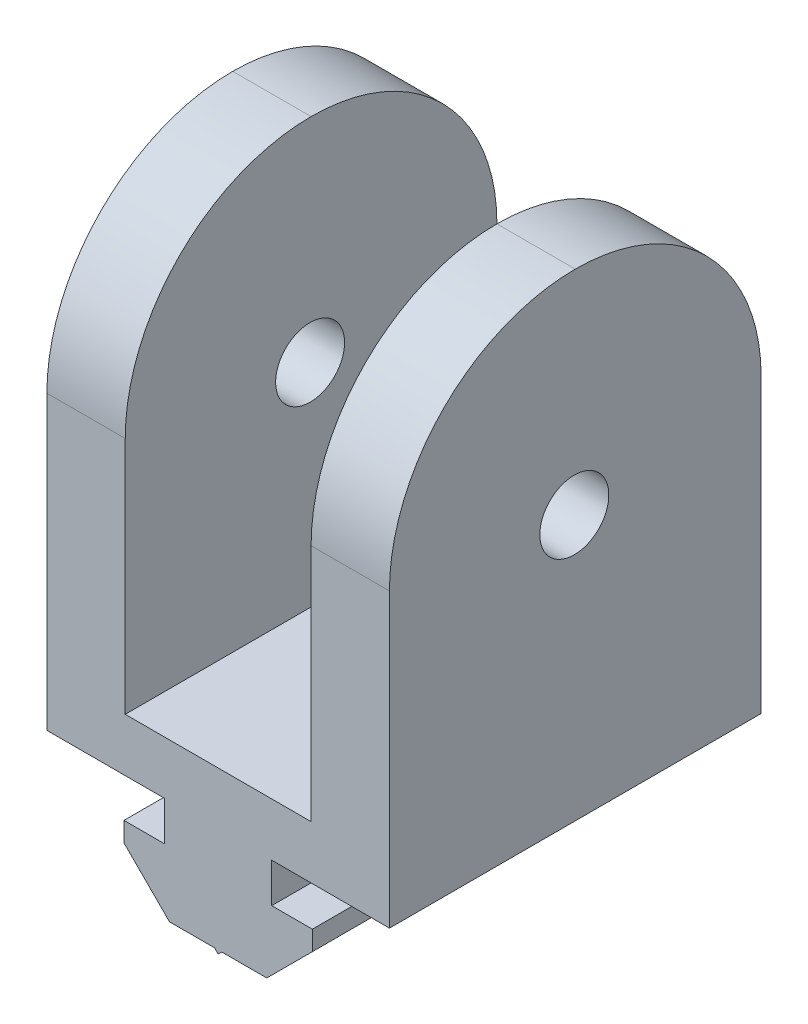
ISO-10303-21;
HEADER;
FILE_DESCRIPTION(('STEP AP214'),'2;1');
FILE_NAME('part.step','',(''),(''),'','','');
FILE_SCHEMA(('AUTOMOTIVE_DESIGN { 1 0 10303 214 1 1 1 1 }'));
ENDSEC;
DATA;
#1=APPLICATION_CONTEXT('core data for automotive mechanical design processes');
#2=APPLICATION_PROTOCOL_DEFINITION('international standard','automotive_design',2000,#1);
#3=PRODUCT_CONTEXT('',#1,'mechanical');
#4=PRODUCT('Part','Part','',(#3));
#5=PRODUCT_RELATED_PRODUCT_CATEGORY('part','',(#4));
#6=PRODUCT_DEFINITION_FORMATION('','',#4);
#7=PRODUCT_DEFINITION_CONTEXT('part definition',#1,'design');
#8=PRODUCT_DEFINITION('design','',#6,#7);
#9=PRODUCT_DEFINITION_SHAPE('','',#8);
#10=(LENGTH_UNIT() NAMED_UNIT(*) SI_UNIT(.MILLI.,.METRE.));
#11=(NAMED_UNIT(*) PLANE_ANGLE_UNIT() SI_UNIT($,.RADIAN.));
#12=(NAMED_UNIT(*) SI_UNIT($,.STERADIAN.) SOLID_ANGLE_UNIT());
#13=UNCERTAINTY_MEASURE_WITH_UNIT(LENGTH_MEASURE(1.E-05),#10,'distance_accuracy_value','');
#14=(GEOMETRIC_REPRESENTATION_CONTEXT(3) GLOBAL_UNCERTAINTY_ASSIGNED_CONTEXT((#13)) GLOBAL_UNIT_ASSIGNED_CONTEXT((#10,
#11,#12)) REPRESENTATION_CONTEXT('',''));
#15=CARTESIAN_POINT('',(0.,0.,0.));
#16=DIRECTION('',(0.,0.,1.));
#17=DIRECTION('',(1.,0.,0.));
#18=AXIS2_PLACEMENT_3D('',#15,#16,#17);
#19=CARTESIAN_POINT('',(0.,0.,0.));
#20=DIRECTION('',(0.,1.,0.));
#21=DIRECTION('',(0.,0.,1.));
#22=AXIS2_PLACEMENT_3D('',#19,#20,#21);
#23=PLANE('',#22);
#24=DIRECTION('',(0.,0.,-1.));
#25=VECTOR('',#24,1.);
#26=CARTESIAN_POINT('',(-11.6351031276717,0.,46.3308796469463));
#27=LINE('',#26,#25);
#28=CARTESIAN_POINT('',(-11.6351031276717,0.,12.4088068181818));
#29=VERTEX_POINT('',#28);
#30=CARTESIAN_POINT('',(-11.6351031276717,0.,-9.29119318181818));
#31=VERTEX_POINT('',#30);
#32=EDGE_CURVE('E257',#29,#31,#27,.T.);
#33=ORIENTED_EDGE('',*,*,#32,.T.);
#34=DIRECTION('',(-1.,0.,0.));
#35=VECTOR('',#34,1.);
#36=CARTESIAN_POINT('',(-18.8401031276717,0.,-9.29119318181818));
#37=LINE('',#36,#35);
#38=CARTESIAN_POINT('',(-4.7601031276717,0.,-9.29119318181818));
#39=VERTEX_POINT('',#38);
#40=EDGE_CURVE('E218',#39,#31,#37,.T.);
#41=ORIENTED_EDGE('',*,*,#40,.F.);
#42=DIRECTION('',(0.,0.,-1.));
#43=VECTOR('',#42,1.);
#44=CARTESIAN_POINT('',(-4.7601031276717,0.,25.0901356129099));
#45=LINE('',#44,#43);
#46=CARTESIAN_POINT('',(-4.7601031276717,0.,12.4088068181818));
#47=VERTEX_POINT('',#46);
#48=EDGE_CURVE('E343',#47,#39,#45,.T.);
#49=ORIENTED_EDGE('',*,*,#48,.F.);
#50=DIRECTION('',(1.,0.,0.));
#51=VECTOR('',#50,1.);
#52=CARTESIAN_POINT('',(-18.8401031276717,0.,12.4088068181818));
#53=LINE('',#52,#51);
#54=EDGE_CURVE('E224',#29,#47,#53,.T.);
#55=ORIENTED_EDGE('',*,*,#54,.F.);
#56=EDGE_LOOP('',(#33,#41,#49,#55));
#57=FACE_BOUND('',#56,.T.);
#58=ADVANCED_FACE('F35',(#57),#23,.F.);
#59=CARTESIAN_POINT('',(-18.8401031276717,3.1,12.4088068181818));
#60=DIRECTION('',(0.,0.,-1.));
#61=DIRECTION('',(-1.,0.,0.));
#62=AXIS2_PLACEMENT_3D('',#59,#60,#61);
#63=PLANE('',#62);
#64=CARTESIAN_POINT('',(1.4898968723283,0.,12.4088068181818));
#65=VERTEX_POINT('',#64);
#66=CARTESIAN_POINT('',(8.36489687232829,0.,12.4088068181818));
#67=VERTEX_POINT('',#66);
#68=EDGE_CURVE('E374',#65,#67,#53,.T.);
#69=ORIENTED_EDGE('',*,*,#68,.T.);
#70=DIRECTION('',(0.,-1.,0.));
#71=VECTOR('',#70,1.);
#72=CARTESIAN_POINT('',(8.3648968723283,0.,12.4088068181818));
#73=LINE('',#72,#71);
#74=CARTESIAN_POINT('',(8.3648968723283,17.05,12.4088068181818));
#75=VERTEX_POINT('',#74);
#76=EDGE_CURVE('E196',#75,#67,#73,.T.);
#77=ORIENTED_EDGE('',*,*,#76,.F.);
#78=DIRECTION('',(1.,0.,0.));
#79=VECTOR('',#78,1.);
#80=CARTESIAN_POINT('',(3.7898968723283,17.05,12.4088068181818));
#81=LINE('',#80,#79);
#82=CARTESIAN_POINT('',(3.7898968723283,17.05,12.4088068181818));
#83=VERTEX_POINT('',#82);
#84=EDGE_CURVE('E231',#75,#83,#81,.F.);
#85=ORIENTED_EDGE('',*,*,#84,.T.);
#86=DIRECTION('',(0.,-1.,0.));
#87=VECTOR('',#86,1.);
#88=CARTESIAN_POINT('',(3.7898968723283,27.9,12.4088068181818));
#89=LINE('',#88,#87);
#90=CARTESIAN_POINT('',(3.7898968723283,3.1,12.4088068181818));
#91=VERTEX_POINT('',#90);
#92=EDGE_CURVE('E365',#83,#91,#89,.T.);
#93=ORIENTED_EDGE('',*,*,#92,.T.);
#94=DIRECTION('',(1.,0.,0.));
#95=VECTOR('',#94,1.);
#96=CARTESIAN_POINT('',(-18.8401031276717,3.1,12.4088068181818));
#97=LINE('',#96,#95);
#98=CARTESIAN_POINT('',(-7.0601031276717,3.1,12.4088068181818));
#99=VERTEX_POINT('',#98);
#100=EDGE_CURVE('E217',#99,#91,#97,.T.);
#101=ORIENTED_EDGE('',*,*,#100,.F.);
#102=DIRECTION('',(0.,-1.,0.));
#103=VECTOR('',#102,1.);
#104=CARTESIAN_POINT('',(-7.0601031276717,27.9,12.4088068181818));
#105=LINE('',#104,#103);
#106=CARTESIAN_POINT('',(-7.0601031276717,17.05,12.4088068181818));
#107=VERTEX_POINT('',#106);
#108=EDGE_CURVE('E373',#107,#99,#105,.T.);
#109=ORIENTED_EDGE('',*,*,#108,.F.);
#110=DIRECTION('',(1.,0.,0.));
#111=VECTOR('',#110,1.);
#112=CARTESIAN_POINT('',(-12.6401031276717,17.05,12.4088068181818));
#113=LINE('',#112,#111);
#114=CARTESIAN_POINT('',(-11.6351031276717,17.05,12.4088068181818));
#115=VERTEX_POINT('',#114);
#116=EDGE_CURVE('E228',#107,#115,#113,.F.);
#117=ORIENTED_EDGE('',*,*,#116,.T.);
#118=DIRECTION('',(0.,-1.,0.));
#119=VECTOR('',#118,1.);
#120=CARTESIAN_POINT('',(-11.6351031276717,0.,12.4088068181818));
#121=LINE('',#120,#119);
#122=EDGE_CURVE('E211',#115,#29,#121,.T.);
#123=ORIENTED_EDGE('',*,*,#122,.T.);
#124=ORIENTED_EDGE('',*,*,#54,.T.);
#125=DIRECTION('',(0.,1.,0.));
#126=VECTOR('',#125,1.);
#127=CARTESIAN_POINT('',(-4.7601031276717,0.,12.4088068181818));
#128=LINE('',#127,#126);
#129=CARTESIAN_POINT('',(-4.7601031276717,-2.3,12.4088068181818));
#130=VERTEX_POINT('',#129);
#131=EDGE_CURVE('E278',#130,#47,#128,.T.);
#132=ORIENTED_EDGE('',*,*,#131,.F.);
#133=DIRECTION('',(1.,0.,0.));
#134=VECTOR('',#133,1.);
#135=CARTESIAN_POINT('',(0.,-2.3,12.4088068181818));
#136=LINE('',#135,#134);
#137=CARTESIAN_POINT('',(-7.1351031276717,-2.3,12.4088068181818));
#138=VERTEX_POINT('',#137);
#139=EDGE_CURVE('E275',#138,#130,#136,.T.);
#140=ORIENTED_EDGE('',*,*,#139,.F.);
#141=DIRECTION('',(0.,-1.,0.));
#142=VECTOR('',#141,1.);
#143=CARTESIAN_POINT('',(-7.1351031276717,0.,12.4088068181818));
#144=LINE('',#143,#142);
#145=CARTESIAN_POINT('',(-7.1351031276717,-3.43933982822025,12.4088068181818));
#146=VERTEX_POINT('',#145);
#147=EDGE_CURVE('E273',#138,#146,#144,.T.);
#148=ORIENTED_EDGE('',*,*,#147,.T.);
#149=DIRECTION('',(0.707106781186551,-0.707106781186544,0.));
#150=VECTOR('',#149,1.);
#151=CARTESIAN_POINT('',(-5.28722147794593,-5.28722147794599,12.4088068181818));
#152=LINE('',#151,#150);
#153=CARTESIAN_POINT('',(-4.47444295589192,-6.1,12.4088068181818));
#154=VERTEX_POINT('',#153);
#155=EDGE_CURVE('E270',#146,#154,#152,.T.);
#156=ORIENTED_EDGE('',*,*,#155,.T.);
#157=DIRECTION('',(1.,0.,0.));
#158=VECTOR('',#157,1.);
#159=CARTESIAN_POINT('',(0.,-6.1,12.4088068181818));
#160=LINE('',#159,#158);
#161=CARTESIAN_POINT('',(-1.8451031276717,-6.1,12.4088068181818));
#162=VERTEX_POINT('',#161);
#163=EDGE_CURVE('E268',#154,#162,#160,.T.);
#164=ORIENTED_EDGE('',*,*,#163,.T.);
#165=DIRECTION('',(0.707106781186551,-0.707106781186544,0.));
#166=VECTOR('',#165,1.);
#167=CARTESIAN_POINT('',(-3.97255156383584,-3.97255156383588,12.4088068181818));
#168=LINE('',#167,#166);
#169=CARTESIAN_POINT('',(-1.6351031276717,-6.31,12.4088068181818));
#170=VERTEX_POINT('',#169);
#171=EDGE_CURVE('E297',#162,#170,#168,.T.);
#172=ORIENTED_EDGE('',*,*,#171,.T.);
#173=DIRECTION('',(-0.707106781186551,-0.707106781186544,0.));
#174=VECTOR('',#173,1.);
#175=CARTESIAN_POINT('',(2.33744843616416,-2.33744843616419,12.4088068181818));
#176=LINE('',#175,#174);
#177=CARTESIAN_POINT('',(-1.4251031276717,-6.1,12.4088068181818));
#178=VERTEX_POINT('',#177);
#179=EDGE_CURVE('E294',#178,#170,#176,.T.);
#180=ORIENTED_EDGE('',*,*,#179,.F.);
#181=DIRECTION('',(-1.,0.,0.));
#182=VECTOR('',#181,1.);
#183=CARTESIAN_POINT('',(0.,-6.1,12.4088068181818));
#184=LINE('',#183,#182);
#185=CARTESIAN_POINT('',(1.20423670054852,-6.1,12.4088068181818));
#186=VERTEX_POINT('',#185);
#187=EDGE_CURVE('E291',#186,#178,#184,.T.);
#188=ORIENTED_EDGE('',*,*,#187,.F.);
#189=DIRECTION('',(-0.707106781186551,-0.707106781186544,0.));
#190=VECTOR('',#189,1.);
#191=CARTESIAN_POINT('',(3.65211835027425,-3.65211835027429,12.4088068181818));
#192=LINE('',#191,#190);
#193=CARTESIAN_POINT('',(3.8648968723283,-3.43933982822025,12.4088068181818));
#194=VERTEX_POINT('',#193);
#195=EDGE_CURVE('E288',#194,#186,#192,.T.);
#196=ORIENTED_EDGE('',*,*,#195,.F.);
#197=DIRECTION('',(0.,-1.,0.));
#198=VECTOR('',#197,1.);
#199=CARTESIAN_POINT('',(3.8648968723283,0.,12.4088068181818));
#200=LINE('',#199,#198);
#201=CARTESIAN_POINT('',(3.8648968723283,-2.3,12.4088068181818));
#202=VERTEX_POINT('',#201);
#203=EDGE_CURVE('E285',#202,#194,#200,.T.);
#204=ORIENTED_EDGE('',*,*,#203,.F.);
#205=DIRECTION('',(-1.,0.,0.));
#206=VECTOR('',#205,1.);
#207=CARTESIAN_POINT('',(0.,-2.3,12.4088068181818));
#208=LINE('',#207,#206);
#209=CARTESIAN_POINT('',(1.4898968723283,-2.3,12.4088068181818));
#210=VERTEX_POINT('',#209);
#211=EDGE_CURVE('E283',#202,#210,#208,.T.);
#212=ORIENTED_EDGE('',*,*,#211,.T.);
#213=DIRECTION('',(0.,1.,0.));
#214=VECTOR('',#213,1.);
#215=CARTESIAN_POINT('',(1.4898968723283,0.,12.4088068181818));
#216=LINE('',#215,#214);
#217=EDGE_CURVE('E281',#210,#65,#216,.T.);
#218=ORIENTED_EDGE('',*,*,#217,.T.);
#219=EDGE_LOOP('',(#69,#77,#85,#93,#101,#109,#117,#123,#124,#132,#140,#148,#156,#164,#172,#180,
#188,#196,#204,#212,#218));
#220=FACE_BOUND('',#219,.T.);
#221=ADVANCED_FACE('F392',(#220),#63,.F.);
#222=CARTESIAN_POINT('',(-18.8401031276717,3.1,-9.29119318181818));
#223=DIRECTION('',(0.,0.,1.));
#224=DIRECTION('',(1.,0.,0.));
#225=AXIS2_PLACEMENT_3D('',#222,#223,#224);
#226=PLANE('',#225);
#227=DIRECTION('',(-1.,0.,0.));
#228=VECTOR('',#227,1.);
#229=CARTESIAN_POINT('',(9.3698968723283,17.05,-9.29119318181818));
#230=LINE('',#229,#228);
#231=CARTESIAN_POINT('',(3.7898968723283,17.05,-9.29119318181818));
#232=VERTEX_POINT('',#231);
#233=CARTESIAN_POINT('',(8.3648968723283,17.05,-9.29119318181818));
#234=VERTEX_POINT('',#233);
#235=EDGE_CURVE('E210',#232,#234,#230,.F.);
#236=ORIENTED_EDGE('',*,*,#235,.T.);
#237=DIRECTION('',(0.,1.,0.));
#238=VECTOR('',#237,1.);
#239=CARTESIAN_POINT('',(8.3648968723283,0.,-9.29119318181818));
#240=LINE('',#239,#238);
#241=CARTESIAN_POINT('',(8.36489687232829,0.,-9.29119318181818));
#242=VERTEX_POINT('',#241);
#243=EDGE_CURVE('E194',#242,#234,#240,.T.);
#244=ORIENTED_EDGE('',*,*,#243,.F.);
#245=CARTESIAN_POINT('',(1.4898968723283,0.,-9.29119318181818));
#246=VERTEX_POINT('',#245);
#247=EDGE_CURVE('E206',#242,#246,#37,.T.);
#248=ORIENTED_EDGE('',*,*,#247,.T.);
#249=DIRECTION('',(0.,-1.,0.));
#250=VECTOR('',#249,1.);
#251=CARTESIAN_POINT('',(1.4898968723283,0.,-9.29119318181818));
#252=LINE('',#251,#250);
#253=CARTESIAN_POINT('',(1.4898968723283,-2.3,-9.29119318181818));
#254=VERTEX_POINT('',#253);
#255=EDGE_CURVE('E318',#246,#254,#252,.T.);
#256=ORIENTED_EDGE('',*,*,#255,.T.);
#257=DIRECTION('',(1.,0.,0.));
#258=VECTOR('',#257,1.);
#259=CARTESIAN_POINT('',(0.,-2.3,-9.29119318181818));
#260=LINE('',#259,#258);
#261=CARTESIAN_POINT('',(3.8648968723283,-2.3,-9.29119318181818));
#262=VERTEX_POINT('',#261);
#263=EDGE_CURVE('E320',#254,#262,#260,.T.);
#264=ORIENTED_EDGE('',*,*,#263,.T.);
#265=DIRECTION('',(0.,1.,0.));
#266=VECTOR('',#265,1.);
#267=CARTESIAN_POINT('',(3.8648968723283,0.,-9.29119318181818));
#268=LINE('',#267,#266);
#269=CARTESIAN_POINT('',(3.8648968723283,-3.43933982822025,-9.29119318181818));
#270=VERTEX_POINT('',#269);
#271=EDGE_CURVE('E323',#270,#262,#268,.T.);
#272=ORIENTED_EDGE('',*,*,#271,.F.);
#273=DIRECTION('',(0.707106781186551,0.707106781186544,0.));
#274=VECTOR('',#273,1.);
#275=CARTESIAN_POINT('',(3.65211835027425,-3.65211835027429,-9.29119318181818));
#276=LINE('',#275,#274);
#277=CARTESIAN_POINT('',(1.20423670054852,-6.1,-9.29119318181818));
#278=VERTEX_POINT('',#277);
#279=EDGE_CURVE('E326',#278,#270,#276,.T.);
#280=ORIENTED_EDGE('',*,*,#279,.F.);
#281=DIRECTION('',(1.,0.,0.));
#282=VECTOR('',#281,1.);
#283=CARTESIAN_POINT('',(0.,-6.1,-9.29119318181818));
#284=LINE('',#283,#282);
#285=CARTESIAN_POINT('',(-1.4251031276717,-6.1,-9.29119318181818));
#286=VERTEX_POINT('',#285);
#287=EDGE_CURVE('E329',#286,#278,#284,.T.);
#288=ORIENTED_EDGE('',*,*,#287,.F.);
#289=DIRECTION('',(0.707106781186551,0.707106781186544,0.));
#290=VECTOR('',#289,1.);
#291=CARTESIAN_POINT('',(2.33744843616416,-2.33744843616419,-9.29119318181818));
#292=LINE('',#291,#290);
#293=CARTESIAN_POINT('',(-1.6351031276717,-6.31,-9.29119318181818));
#294=VERTEX_POINT('',#293);
#295=EDGE_CURVE('E267',#294,#286,#292,.T.);
#296=ORIENTED_EDGE('',*,*,#295,.F.);
#297=DIRECTION('',(-0.707106781186551,0.707106781186544,0.));
#298=VECTOR('',#297,1.);
#299=CARTESIAN_POINT('',(-3.97255156383584,-3.97255156383588,-9.29119318181818));
#300=LINE('',#299,#298);
#301=CARTESIAN_POINT('',(-1.8451031276717,-6.1,-9.29119318181818));
#302=VERTEX_POINT('',#301);
#303=EDGE_CURVE('E300',#294,#302,#300,.T.);
#304=ORIENTED_EDGE('',*,*,#303,.T.);
#305=DIRECTION('',(-1.,0.,0.));
#306=VECTOR('',#305,1.);
#307=CARTESIAN_POINT('',(0.,-6.1,-9.29119318181818));
#308=LINE('',#307,#306);
#309=CARTESIAN_POINT('',(-4.47444295589192,-6.1,-9.29119318181818));
#310=VERTEX_POINT('',#309);
#311=EDGE_CURVE('E303',#302,#310,#308,.T.);
#312=ORIENTED_EDGE('',*,*,#311,.T.);
#313=DIRECTION('',(-0.707106781186551,0.707106781186544,0.));
#314=VECTOR('',#313,1.);
#315=CARTESIAN_POINT('',(-5.28722147794593,-5.28722147794599,-9.29119318181818));
#316=LINE('',#315,#314);
#317=CARTESIAN_POINT('',(-7.1351031276717,-3.43933982822025,-9.29119318181818));
#318=VERTEX_POINT('',#317);
#319=EDGE_CURVE('E306',#310,#318,#316,.T.);
#320=ORIENTED_EDGE('',*,*,#319,.T.);
#321=DIRECTION('',(0.,1.,0.));
#322=VECTOR('',#321,1.);
#323=CARTESIAN_POINT('',(-7.1351031276717,0.,-9.29119318181818));
#324=LINE('',#323,#322);
#325=CARTESIAN_POINT('',(-7.1351031276717,-2.3,-9.29119318181818));
#326=VERTEX_POINT('',#325);
#327=EDGE_CURVE('E309',#318,#326,#324,.T.);
#328=ORIENTED_EDGE('',*,*,#327,.T.);
#329=DIRECTION('',(-1.,0.,0.));
#330=VECTOR('',#329,1.);
#331=CARTESIAN_POINT('',(0.,-2.3,-9.29119318181818));
#332=LINE('',#331,#330);
#333=CARTESIAN_POINT('',(-4.7601031276717,-2.3,-9.29119318181818));
#334=VERTEX_POINT('',#333);
#335=EDGE_CURVE('E312',#334,#326,#332,.T.);
#336=ORIENTED_EDGE('',*,*,#335,.F.);
#337=DIRECTION('',(0.,-1.,0.));
#338=VECTOR('',#337,1.);
#339=CARTESIAN_POINT('',(-4.7601031276717,0.,-9.29119318181818));
#340=LINE('',#339,#338);
#341=EDGE_CURVE('E315',#39,#334,#340,.T.);
#342=ORIENTED_EDGE('',*,*,#341,.F.);
#343=ORIENTED_EDGE('',*,*,#40,.T.);
#344=DIRECTION('',(0.,1.,0.));
#345=VECTOR('',#344,1.);
#346=CARTESIAN_POINT('',(-11.6351031276717,0.,-9.29119318181818));
#347=LINE('',#346,#345);
#348=CARTESIAN_POINT('',(-11.6351031276717,17.05,-9.29119318181818));
#349=VERTEX_POINT('',#348);
#350=EDGE_CURVE('E258',#31,#349,#347,.T.);
#351=ORIENTED_EDGE('',*,*,#350,.T.);
#352=DIRECTION('',(-1.,0.,0.));
#353=VECTOR('',#352,1.);
#354=CARTESIAN_POINT('',(-7.0601031276717,17.05,-9.29119318181818));
#355=LINE('',#354,#353);
#356=CARTESIAN_POINT('',(-7.0601031276717,17.05,-9.29119318181818));
#357=VERTEX_POINT('',#356);
#358=EDGE_CURVE('E238',#349,#357,#355,.F.);
#359=ORIENTED_EDGE('',*,*,#358,.T.);
#360=DIRECTION('',(0.,-1.,0.));
#361=VECTOR('',#360,1.);
#362=CARTESIAN_POINT('',(-7.0601031276717,27.9,-9.29119318181818));
#363=LINE('',#362,#361);
#364=CARTESIAN_POINT('',(-7.0601031276717,3.1,-9.29119318181818));
#365=VERTEX_POINT('',#364);
#366=EDGE_CURVE('E370',#357,#365,#363,.T.);
#367=ORIENTED_EDGE('',*,*,#366,.T.);
#368=DIRECTION('',(-1.,0.,0.));
#369=VECTOR('',#368,1.);
#370=CARTESIAN_POINT('',(-18.8401031276717,3.1,-9.29119318181818));
#371=LINE('',#370,#369);
#372=CARTESIAN_POINT('',(3.7898968723283,3.1,-9.29119318181818));
#373=VERTEX_POINT('',#372);
#374=EDGE_CURVE('E221',#373,#365,#371,.T.);
#375=ORIENTED_EDGE('',*,*,#374,.F.);
#376=DIRECTION('',(0.,-1.,0.));
#377=VECTOR('',#376,1.);
#378=CARTESIAN_POINT('',(3.7898968723283,27.9,-9.29119318181818));
#379=LINE('',#378,#377);
#380=EDGE_CURVE('E363',#232,#373,#379,.T.);
#381=ORIENTED_EDGE('',*,*,#380,.F.);
#382=EDGE_LOOP('',(#236,#244,#248,#256,#264,#272,#280,#288,#296,#304,#312,#320,#328,#336,#342,
#343,#351,#359,#367,#375,#381));
#383=FACE_BOUND('',#382,.T.);
#384=ADVANCED_FACE('F204',(#383),#226,.F.);
#385=CARTESIAN_POINT('',(0.,17.05,1.55880681818182));
#386=DIRECTION('',(-1.,0.,0.));
#387=DIRECTION('',(0.,0.,1.));
#388=AXIS2_PLACEMENT_3D('',#385,#386,#387);
#389=CYLINDRICAL_SURFACE('',#388,10.85);
#390=DIRECTION('',(1.,0.,0.));
#391=VECTOR('',#390,1.);
#392=CARTESIAN_POINT('',(-7.0601031276717,27.9,1.55880681818182));
#393=LINE('',#392,#391);
#394=CARTESIAN_POINT('',(-11.6351031276717,27.9,1.55880681818182));
#395=VERTEX_POINT('',#394);
#396=CARTESIAN_POINT('',(-7.0601031276717,27.9,1.55880681818182));
#397=VERTEX_POINT('',#396);
#398=EDGE_CURVE('E245',#395,#397,#393,.T.);
#399=ORIENTED_EDGE('',*,*,#398,.F.);
#400=CARTESIAN_POINT('',(-11.6351031276717,17.05,1.55880681818182));
#401=DIRECTION('',(-1.,0.,0.));
#402=DIRECTION('',(0.,0.,1.));
#403=AXIS2_PLACEMENT_3D('',#400,#401,#402);
#404=CIRCLE('',#403,10.85);
#405=EDGE_CURVE('E60',#395,#115,#404,.F.);
#406=ORIENTED_EDGE('',*,*,#405,.T.);
#407=ORIENTED_EDGE('',*,*,#116,.F.);
#408=CARTESIAN_POINT('',(-7.0601031276717,17.05,1.55880681818182));
#409=DIRECTION('',(-1.,0.,0.));
#410=DIRECTION('',(0.,0.,1.));
#411=AXIS2_PLACEMENT_3D('',#408,#409,#410);
#412=CIRCLE('',#411,10.85);
#413=EDGE_CURVE('E44',#397,#107,#412,.F.);
#414=ORIENTED_EDGE('',*,*,#413,.F.);
#415=EDGE_LOOP('',(#399,#406,#407,#414));
#416=FACE_BOUND('',#415,.T.);
#417=ADVANCED_FACE('F37',(#416),#389,.T.);
#418=CARTESIAN_POINT('',(0.,17.05,1.55880681818182));
#419=DIRECTION('',(1.,0.,0.));
#420=DIRECTION('',(0.,0.,-1.));
#421=AXIS2_PLACEMENT_3D('',#418,#419,#420);
#422=CYLINDRICAL_SURFACE('',#421,10.85);
#423=ORIENTED_EDGE('',*,*,#358,.F.);
#424=CARTESIAN_POINT('',(-11.6351031276717,17.05,1.55880681818182));
#425=DIRECTION('',(-1.,0.,0.));
#426=DIRECTION('',(0.,0.,1.));
#427=AXIS2_PLACEMENT_3D('',#424,#425,#426);
#428=CIRCLE('',#427,10.85);
#429=EDGE_CURVE('E249',#349,#395,#428,.F.);
#430=ORIENTED_EDGE('',*,*,#429,.T.);
#431=ORIENTED_EDGE('',*,*,#398,.T.);
#432=CARTESIAN_POINT('',(-7.0601031276717,17.05,1.55880681818182));
#433=DIRECTION('',(-1.,0.,0.));
#434=DIRECTION('',(0.,0.,1.));
#435=AXIS2_PLACEMENT_3D('',#432,#433,#434);
#436=CIRCLE('',#435,10.85);
#437=EDGE_CURVE('E11',#357,#397,#436,.F.);
#438=ORIENTED_EDGE('',*,*,#437,.F.);
#439=EDGE_LOOP('',(#423,#430,#431,#438));
#440=FACE_BOUND('',#439,.T.);
#441=ADVANCED_FACE('F396',(#440),#422,.T.);
#442=CARTESIAN_POINT('',(27.6598968723283,15.5,1.61572996420886));
#443=DIRECTION('',(-1.,0.,0.));
#444=DIRECTION('',(0.,0.,1.));
#445=AXIS2_PLACEMENT_3D('',#442,#443,#444);
#446=CYLINDRICAL_SURFACE('',#445,2.015);
#447=CARTESIAN_POINT('',(-7.0601031276717,15.5,1.61572996420886));
#448=DIRECTION('',(-1.,0.,0.));
#449=DIRECTION('',(0.,0.,1.));
#450=AXIS2_PLACEMENT_3D('',#447,#448,#449);
#451=CIRCLE('',#450,2.015);
#452=CARTESIAN_POINT('',(-7.0601031276717,15.5,3.63072996420886));
#453=VERTEX_POINT('',#452);
#454=EDGE_CURVE('E246',#453,#453,#451,.T.);
#455=ORIENTED_EDGE('',*,*,#454,.F.);
#456=EDGE_LOOP('',(#455));
#457=FACE_BOUND('',#456,.T.);
#458=CARTESIAN_POINT('',(-11.6351031276717,15.5,1.61572996420886));
#459=DIRECTION('',(-1.,0.,0.));
#460=DIRECTION('',(0.,0.,1.));
#461=AXIS2_PLACEMENT_3D('',#458,#459,#460);
#462=CIRCLE('',#461,2.015);
#463=CARTESIAN_POINT('',(-11.6351031276717,15.5,3.63072996420886));
#464=VERTEX_POINT('',#463);
#465=EDGE_CURVE('E247',#464,#464,#462,.F.);
#466=ORIENTED_EDGE('',*,*,#465,.F.);
#467=EDGE_LOOP('',(#466));
#468=FACE_BOUND('',#467,.T.);
#469=ADVANCED_FACE('F489',(#457,#468),#446,.F.);
#470=CARTESIAN_POINT('',(0.,3.1,0.));
#471=DIRECTION('',(0.,1.,0.));
#472=DIRECTION('',(0.,0.,1.));
#473=AXIS2_PLACEMENT_3D('',#470,#471,#472);
#474=PLANE('',#473);
#475=ORIENTED_EDGE('',*,*,#100,.T.);
#476=DIRECTION('',(0.,0.,1.));
#477=VECTOR('',#476,1.);
#478=CARTESIAN_POINT('',(3.7898968723283,3.1,-9.29119318181818));
#479=LINE('',#478,#477);
#480=EDGE_CURVE('E244',#373,#91,#479,.T.);
#481=ORIENTED_EDGE('',*,*,#480,.F.);
#482=ORIENTED_EDGE('',*,*,#374,.T.);
#483=DIRECTION('',(0.,0.,-1.));
#484=VECTOR('',#483,1.);
#485=CARTESIAN_POINT('',(-7.0601031276717,3.1,-9.29119318181818));
#486=LINE('',#485,#484);
#487=EDGE_CURVE('E368',#99,#365,#486,.T.);
#488=ORIENTED_EDGE('',*,*,#487,.F.);
#489=EDGE_LOOP('',(#475,#481,#482,#488));
#490=FACE_BOUND('',#489,.T.);
#491=ADVANCED_FACE('F380',(#490),#474,.T.);
#492=ORIENTED_EDGE('',*,*,#247,.F.);
#493=DIRECTION('',(0.,0.,-1.));
#494=VECTOR('',#493,1.);
#495=CARTESIAN_POINT('',(8.36489687232829,0.,46.3308796469463));
#496=LINE('',#495,#494);
#497=EDGE_CURVE('E190',#67,#242,#496,.T.);
#498=ORIENTED_EDGE('',*,*,#497,.F.);
#499=ORIENTED_EDGE('',*,*,#68,.F.);
#500=DIRECTION('',(0.,0.,-1.));
#501=VECTOR('',#500,1.);
#502=CARTESIAN_POINT('',(1.4898968723283,0.,25.0901356129099));
#503=LINE('',#502,#501);
#504=EDGE_CURVE('E216',#65,#246,#503,.T.);
#505=ORIENTED_EDGE('',*,*,#504,.T.);
#506=EDGE_LOOP('',(#492,#498,#499,#505));
#507=FACE_BOUND('',#506,.T.);
#508=ADVANCED_FACE('F214',(#507),#23,.F.);
#509=CARTESIAN_POINT('',(-7.0601031276717,27.9,-9.29119318181818));
#510=DIRECTION('',(-1.,0.,0.));
#511=DIRECTION('',(0.,0.,1.));
#512=AXIS2_PLACEMENT_3D('',#509,#510,#511);
#513=PLANE('',#512);
#514=ORIENTED_EDGE('',*,*,#487,.T.);
#515=ORIENTED_EDGE('',*,*,#366,.F.);
#516=ORIENTED_EDGE('',*,*,#437,.T.);
#517=ORIENTED_EDGE('',*,*,#413,.T.);
#518=ORIENTED_EDGE('',*,*,#108,.T.);
#519=EDGE_LOOP('',(#514,#515,#516,#517,#518));
#520=FACE_BOUND('',#519,.T.);
#521=ORIENTED_EDGE('',*,*,#454,.T.);
#522=EDGE_LOOP('',(#521));
#523=FACE_BOUND('',#522,.T.);
#524=ADVANCED_FACE('F386',(#520,#523),#513,.F.);
#525=CARTESIAN_POINT('',(3.7898968723283,27.9,-9.29119318181818));
#526=DIRECTION('',(1.,0.,0.));
#527=DIRECTION('',(0.,0.,-1.));
#528=AXIS2_PLACEMENT_3D('',#525,#526,#527);
#529=PLANE('',#528);
#530=CARTESIAN_POINT('',(3.7898968723283,15.5,1.61572996420886));
#531=DIRECTION('',(1.,0.,0.));
#532=DIRECTION('',(0.,0.,-1.));
#533=AXIS2_PLACEMENT_3D('',#530,#531,#532);
#534=CIRCLE('',#533,2.015);
#535=CARTESIAN_POINT('',(3.7898968723283,15.5,-0.399270035791137));
#536=VERTEX_POINT('',#535);
#537=EDGE_CURVE('E357',#536,#536,#534,.T.);
#538=ORIENTED_EDGE('',*,*,#537,.T.);
#539=EDGE_LOOP('',(#538));
#540=FACE_BOUND('',#539,.T.);
#541=ORIENTED_EDGE('',*,*,#480,.T.);
#542=ORIENTED_EDGE('',*,*,#92,.F.);
#543=CARTESIAN_POINT('',(3.7898968723283,17.05,1.55880681818182));
#544=DIRECTION('',(1.,0.,0.));
#545=DIRECTION('',(0.,0.,-1.));
#546=AXIS2_PLACEMENT_3D('',#543,#544,#545);
#547=CIRCLE('',#546,10.85);
#548=CARTESIAN_POINT('',(3.7898968723283,27.9,1.55880681818182));
#549=VERTEX_POINT('',#548);
#550=EDGE_CURVE('E235',#83,#549,#547,.F.);
#551=ORIENTED_EDGE('',*,*,#550,.T.);
#552=CARTESIAN_POINT('',(3.7898968723283,17.05,1.55880681818182));
#553=DIRECTION('',(1.,0.,0.));
#554=DIRECTION('',(0.,0.,-1.));
#555=AXIS2_PLACEMENT_3D('',#552,#553,#554);
#556=CIRCLE('',#555,10.85);
#557=EDGE_CURVE('E233',#549,#232,#556,.F.);
#558=ORIENTED_EDGE('',*,*,#557,.T.);
#559=ORIENTED_EDGE('',*,*,#380,.T.);
#560=EDGE_LOOP('',(#541,#542,#551,#558,#559));
#561=FACE_BOUND('',#560,.T.);
#562=ADVANCED_FACE('F462',(#540,#561),#529,.F.);
#563=CARTESIAN_POINT('',(0.,17.05,1.55880681818182));
#564=DIRECTION('',(1.,0.,0.));
#565=DIRECTION('',(0.,0.,-1.));
#566=AXIS2_PLACEMENT_3D('',#563,#564,#565);
#567=CYLINDRICAL_SURFACE('',#566,10.85);
#568=CARTESIAN_POINT('',(8.3648968723283,17.05,1.55880681818182));
#569=DIRECTION('',(-1.,0.,0.));
#570=DIRECTION('',(0.,0.,1.));
#571=AXIS2_PLACEMENT_3D('',#568,#569,#570);
#572=CIRCLE('',#571,10.85);
#573=CARTESIAN_POINT('',(8.3648968723283,27.9,1.55880681818182));
#574=VERTEX_POINT('',#573);
#575=EDGE_CURVE('E52',#234,#574,#572,.F.);
#576=ORIENTED_EDGE('',*,*,#575,.F.);
#577=ORIENTED_EDGE('',*,*,#235,.F.);
#578=ORIENTED_EDGE('',*,*,#557,.F.);
#579=DIRECTION('',(-1.,0.,0.));
#580=VECTOR('',#579,1.);
#581=CARTESIAN_POINT('',(3.7898968723283,27.9,1.55880681818182));
#582=LINE('',#581,#580);
#583=EDGE_CURVE('E242',#574,#549,#582,.T.);
#584=ORIENTED_EDGE('',*,*,#583,.F.);
#585=EDGE_LOOP('',(#576,#577,#578,#584));
#586=FACE_BOUND('',#585,.T.);
#587=ADVANCED_FACE('F464',(#586),#567,.T.);
#588=CARTESIAN_POINT('',(0.,17.05,1.55880681818182));
#589=DIRECTION('',(-1.,0.,0.));
#590=DIRECTION('',(0.,0.,1.));
#591=AXIS2_PLACEMENT_3D('',#588,#589,#590);
#592=CYLINDRICAL_SURFACE('',#591,10.85);
#593=CARTESIAN_POINT('',(8.3648968723283,17.05,1.55880681818182));
#594=DIRECTION('',(-1.,0.,0.));
#595=DIRECTION('',(0.,0.,1.));
#596=AXIS2_PLACEMENT_3D('',#593,#594,#595);
#597=CIRCLE('',#596,10.85);
#598=EDGE_CURVE('E264',#574,#75,#597,.F.);
#599=ORIENTED_EDGE('',*,*,#598,.F.);
#600=ORIENTED_EDGE('',*,*,#583,.T.);
#601=ORIENTED_EDGE('',*,*,#550,.F.);
#602=ORIENTED_EDGE('',*,*,#84,.F.);
#603=EDGE_LOOP('',(#599,#600,#601,#602));
#604=FACE_BOUND('',#603,.T.);
#605=ADVANCED_FACE('F457',(#604),#592,.T.);
#606=CARTESIAN_POINT('',(8.3648968723283,15.5,1.61572996420886));
#607=DIRECTION('',(-1.,0.,0.));
#608=DIRECTION('',(0.,0.,1.));
#609=AXIS2_PLACEMENT_3D('',#606,#607,#608);
#610=CIRCLE('',#609,2.015);
#611=CARTESIAN_POINT('',(8.3648968723283,15.5,3.63072996420886));
#612=VERTEX_POINT('',#611);
#613=EDGE_CURVE('E39',#612,#612,#610,.F.);
#614=ORIENTED_EDGE('',*,*,#613,.T.);
#615=EDGE_LOOP('',(#614));
#616=FACE_BOUND('',#615,.T.);
#617=ORIENTED_EDGE('',*,*,#537,.F.);
#618=EDGE_LOOP('',(#617));
#619=FACE_BOUND('',#618,.T.);
#620=ADVANCED_FACE('F471',(#616,#619),#446,.F.);
#621=CARTESIAN_POINT('',(2.33744843616416,-2.33744843616419,25.0901356129099));
#622=DIRECTION('',(-0.707106781186544,0.707106781186551,0.));
#623=DIRECTION('',(-0.707106781186551,-0.707106781186544,0.));
#624=AXIS2_PLACEMENT_3D('',#621,#622,#623);
#625=PLANE('',#624);
#626=DIRECTION('',(0.,0.,-1.));
#627=VECTOR('',#626,1.);
#628=CARTESIAN_POINT('',(-1.4251031276717,-6.1,25.0901356129099));
#629=LINE('',#628,#627);
#630=EDGE_CURVE('E271',#178,#286,#629,.T.);
#631=ORIENTED_EDGE('',*,*,#630,.F.);
#632=ORIENTED_EDGE('',*,*,#179,.T.);
#633=DIRECTION('',(0.,0.,-1.));
#634=VECTOR('',#633,1.);
#635=CARTESIAN_POINT('',(-1.6351031276717,-6.31,25.0901356129099));
#636=LINE('',#635,#634);
#637=EDGE_CURVE('E332',#170,#294,#636,.T.);
#638=ORIENTED_EDGE('',*,*,#637,.T.);
#639=ORIENTED_EDGE('',*,*,#295,.T.);
#640=EDGE_LOOP('',(#631,#632,#638,#639));
#641=FACE_BOUND('',#640,.T.);
#642=ADVANCED_FACE('F432',(#641),#625,.F.);
#643=CARTESIAN_POINT('',(0.,-6.1,25.0901356129099));
#644=DIRECTION('',(0.,1.,0.));
#645=DIRECTION('',(0.,0.,1.));
#646=AXIS2_PLACEMENT_3D('',#643,#644,#645);
#647=PLANE('',#646);
#648=DIRECTION('',(0.,0.,-1.));
#649=VECTOR('',#648,1.);
#650=CARTESIAN_POINT('',(1.20423670054852,-6.1,25.0901356129099));
#651=LINE('',#650,#649);
#652=EDGE_CURVE('E334',#186,#278,#651,.T.);
#653=ORIENTED_EDGE('',*,*,#652,.F.);
#654=ORIENTED_EDGE('',*,*,#187,.T.);
#655=ORIENTED_EDGE('',*,*,#630,.T.);
#656=ORIENTED_EDGE('',*,*,#287,.T.);
#657=EDGE_LOOP('',(#653,#654,#655,#656));
#658=FACE_BOUND('',#657,.T.);
#659=ADVANCED_FACE('F437',(#658),#647,.F.);
#660=CARTESIAN_POINT('',(3.65211835027425,-3.65211835027429,25.0901356129099));
#661=DIRECTION('',(-0.707106781186544,0.707106781186551,0.));
#662=DIRECTION('',(-0.707106781186551,-0.707106781186544,0.));
#663=AXIS2_PLACEMENT_3D('',#660,#661,#662);
#664=PLANE('',#663);
#665=DIRECTION('',(0.,0.,-1.));
#666=VECTOR('',#665,1.);
#667=CARTESIAN_POINT('',(3.8648968723283,-3.43933982822025,25.0901356129099));
#668=LINE('',#667,#666);
#669=EDGE_CURVE('E336',#194,#270,#668,.T.);
#670=ORIENTED_EDGE('',*,*,#669,.F.);
#671=ORIENTED_EDGE('',*,*,#195,.T.);
#672=ORIENTED_EDGE('',*,*,#652,.T.);
#673=ORIENTED_EDGE('',*,*,#279,.T.);
#674=EDGE_LOOP('',(#670,#671,#672,#673));
#675=FACE_BOUND('',#674,.T.);
#676=ADVANCED_FACE('F442',(#675),#664,.F.);
#677=CARTESIAN_POINT('',(3.8648968723283,0.,25.0901356129099));
#678=DIRECTION('',(-1.,0.,0.));
#679=DIRECTION('',(0.,0.,1.));
#680=AXIS2_PLACEMENT_3D('',#677,#678,#679);
#681=PLANE('',#680);
#682=DIRECTION('',(0.,0.,-1.));
#683=VECTOR('',#682,1.);
#684=CARTESIAN_POINT('',(3.8648968723283,-2.3,25.0901356129099));
#685=LINE('',#684,#683);
#686=EDGE_CURVE('E338',#202,#262,#685,.T.);
#687=ORIENTED_EDGE('',*,*,#686,.F.);
#688=ORIENTED_EDGE('',*,*,#203,.T.);
#689=ORIENTED_EDGE('',*,*,#669,.T.);
#690=ORIENTED_EDGE('',*,*,#271,.T.);
#691=EDGE_LOOP('',(#687,#688,#689,#690));
#692=FACE_BOUND('',#691,.T.);
#693=ADVANCED_FACE('F446',(#692),#681,.F.);
#694=CARTESIAN_POINT('',(0.,-2.3,25.0901356129099));
#695=DIRECTION('',(0.,1.,0.));
#696=DIRECTION('',(0.,0.,1.));
#697=AXIS2_PLACEMENT_3D('',#694,#695,#696);
#698=PLANE('',#697);
#699=ORIENTED_EDGE('',*,*,#211,.F.);
#700=ORIENTED_EDGE('',*,*,#686,.T.);
#701=ORIENTED_EDGE('',*,*,#263,.F.);
#702=DIRECTION('',(0.,0.,-1.));
#703=VECTOR('',#702,1.);
#704=CARTESIAN_POINT('',(1.4898968723283,-2.3,25.0901356129099));
#705=LINE('',#704,#703);
#706=EDGE_CURVE('E340',#210,#254,#705,.T.);
#707=ORIENTED_EDGE('',*,*,#706,.F.);
#708=EDGE_LOOP('',(#699,#700,#701,#707));
#709=FACE_BOUND('',#708,.T.);
#710=ADVANCED_FACE('F449',(#709),#698,.T.);
#711=CARTESIAN_POINT('',(1.4898968723283,0.,25.0901356129099));
#712=DIRECTION('',(1.,0.,0.));
#713=DIRECTION('',(0.,1.,0.));
#714=AXIS2_PLACEMENT_3D('',#711,#712,#713);
#715=PLANE('',#714);
#716=ORIENTED_EDGE('',*,*,#217,.F.);
#717=ORIENTED_EDGE('',*,*,#706,.T.);
#718=ORIENTED_EDGE('',*,*,#255,.F.);
#719=ORIENTED_EDGE('',*,*,#504,.F.);
#720=EDGE_LOOP('',(#716,#717,#718,#719));
#721=FACE_BOUND('',#720,.T.);
#722=ADVANCED_FACE('F453',(#721),#715,.T.);
#723=CARTESIAN_POINT('',(-4.7601031276717,0.,25.0901356129099));
#724=DIRECTION('',(1.,0.,0.));
#725=DIRECTION('',(0.,1.,0.));
#726=AXIS2_PLACEMENT_3D('',#723,#724,#725);
#727=PLANE('',#726);
#728=DIRECTION('',(0.,0.,-1.));
#729=VECTOR('',#728,1.);
#730=CARTESIAN_POINT('',(-4.7601031276717,-2.3,25.0901356129099));
#731=LINE('',#730,#729);
#732=EDGE_CURVE('E345',#130,#334,#731,.T.);
#733=ORIENTED_EDGE('',*,*,#732,.F.);
#734=ORIENTED_EDGE('',*,*,#131,.T.);
#735=ORIENTED_EDGE('',*,*,#48,.T.);
#736=ORIENTED_EDGE('',*,*,#341,.T.);
#737=EDGE_LOOP('',(#733,#734,#735,#736));
#738=FACE_BOUND('',#737,.T.);
#739=ADVANCED_FACE('F406',(#738),#727,.F.);
#740=CARTESIAN_POINT('',(0.,-2.3,25.0901356129099));
#741=DIRECTION('',(0.,-1.,0.));
#742=DIRECTION('',(0.,0.,-1.));
#743=AXIS2_PLACEMENT_3D('',#740,#741,#742);
#744=PLANE('',#743);
#745=DIRECTION('',(0.,0.,-1.));
#746=VECTOR('',#745,1.);
#747=CARTESIAN_POINT('',(-7.1351031276717,-2.3,25.0901356129099));
#748=LINE('',#747,#746);
#749=EDGE_CURVE('E347',#138,#326,#748,.T.);
#750=ORIENTED_EDGE('',*,*,#749,.F.);
#751=ORIENTED_EDGE('',*,*,#139,.T.);
#752=ORIENTED_EDGE('',*,*,#732,.T.);
#753=ORIENTED_EDGE('',*,*,#335,.T.);
#754=EDGE_LOOP('',(#750,#751,#752,#753));
#755=FACE_BOUND('',#754,.T.);
#756=ADVANCED_FACE('F409',(#755),#744,.F.);
#757=CARTESIAN_POINT('',(-7.1351031276717,0.,25.0901356129099));
#758=DIRECTION('',(-1.,0.,0.));
#759=DIRECTION('',(0.,0.,1.));
#760=AXIS2_PLACEMENT_3D('',#757,#758,#759);
#761=PLANE('',#760);
#762=ORIENTED_EDGE('',*,*,#147,.F.);
#763=ORIENTED_EDGE('',*,*,#749,.T.);
#764=ORIENTED_EDGE('',*,*,#327,.F.);
#765=DIRECTION('',(0.,0.,-1.));
#766=VECTOR('',#765,1.);
#767=CARTESIAN_POINT('',(-7.1351031276717,-3.43933982822025,25.0901356129099));
#768=LINE('',#767,#766);
#769=EDGE_CURVE('E349',#146,#318,#768,.T.);
#770=ORIENTED_EDGE('',*,*,#769,.F.);
#771=EDGE_LOOP('',(#762,#763,#764,#770));
#772=FACE_BOUND('',#771,.T.);
#773=ADVANCED_FACE('F414',(#772),#761,.T.);
#774=CARTESIAN_POINT('',(-5.28722147794593,-5.28722147794599,25.0901356129099));
#775=DIRECTION('',(-0.707106781186544,-0.707106781186551,0.));
#776=DIRECTION('',(0.707106781186551,-0.707106781186544,0.));
#777=AXIS2_PLACEMENT_3D('',#774,#775,#776);
#778=PLANE('',#777);
#779=ORIENTED_EDGE('',*,*,#155,.F.);
#780=ORIENTED_EDGE('',*,*,#769,.T.);
#781=ORIENTED_EDGE('',*,*,#319,.F.);
#782=DIRECTION('',(0.,0.,-1.));
#783=VECTOR('',#782,1.);
#784=CARTESIAN_POINT('',(-4.47444295589192,-6.1,25.0901356129099));
#785=LINE('',#784,#783);
#786=EDGE_CURVE('E351',#154,#310,#785,.T.);
#787=ORIENTED_EDGE('',*,*,#786,.F.);
#788=EDGE_LOOP('',(#779,#780,#781,#787));
#789=FACE_BOUND('',#788,.T.);
#790=ADVANCED_FACE('F418',(#789),#778,.T.);
#791=CARTESIAN_POINT('',(0.,-6.1,25.0901356129099));
#792=DIRECTION('',(0.,-1.,0.));
#793=DIRECTION('',(0.,0.,-1.));
#794=AXIS2_PLACEMENT_3D('',#791,#792,#793);
#795=PLANE('',#794);
#796=ORIENTED_EDGE('',*,*,#163,.F.);
#797=ORIENTED_EDGE('',*,*,#786,.T.);
#798=ORIENTED_EDGE('',*,*,#311,.F.);
#799=DIRECTION('',(0.,0.,-1.));
#800=VECTOR('',#799,1.);
#801=CARTESIAN_POINT('',(-1.8451031276717,-6.1,25.0901356129099));
#802=LINE('',#801,#800);
#803=EDGE_CURVE('E353',#162,#302,#802,.T.);
#804=ORIENTED_EDGE('',*,*,#803,.F.);
#805=EDGE_LOOP('',(#796,#797,#798,#804));
#806=FACE_BOUND('',#805,.T.);
#807=ADVANCED_FACE('F423',(#806),#795,.T.);
#808=CARTESIAN_POINT('',(-3.97255156383584,-3.97255156383588,25.0901356129099));
#809=DIRECTION('',(-0.707106781186544,-0.707106781186551,0.));
#810=DIRECTION('',(0.707106781186551,-0.707106781186544,0.));
#811=AXIS2_PLACEMENT_3D('',#808,#809,#810);
#812=PLANE('',#811);
#813=ORIENTED_EDGE('',*,*,#171,.F.);
#814=ORIENTED_EDGE('',*,*,#803,.T.);
#815=ORIENTED_EDGE('',*,*,#303,.F.);
#816=ORIENTED_EDGE('',*,*,#637,.F.);
#817=EDGE_LOOP('',(#813,#814,#815,#816));
#818=FACE_BOUND('',#817,.T.);
#819=ADVANCED_FACE('F429',(#818),#812,.T.);
#820=CARTESIAN_POINT('',(-11.6351031276717,0.,46.3308796469463));
#821=DIRECTION('',(-1.,0.,0.));
#822=DIRECTION('',(0.,0.,1.));
#823=AXIS2_PLACEMENT_3D('',#820,#821,#822);
#824=PLANE('',#823);
#825=ORIENTED_EDGE('',*,*,#429,.F.);
#826=ORIENTED_EDGE('',*,*,#350,.F.);
#827=ORIENTED_EDGE('',*,*,#32,.F.);
#828=ORIENTED_EDGE('',*,*,#122,.F.);
#829=ORIENTED_EDGE('',*,*,#405,.F.);
#830=EDGE_LOOP('',(#825,#826,#827,#828,#829));
#831=FACE_BOUND('',#830,.T.);
#832=ORIENTED_EDGE('',*,*,#465,.T.);
#833=EDGE_LOOP('',(#832));
#834=FACE_BOUND('',#833,.T.);
#835=ADVANCED_FACE('F397',(#831,#834),#824,.T.);
#836=CARTESIAN_POINT('',(8.3648968723283,0.,46.3308796469463));
#837=DIRECTION('',(-1.,0.,0.));
#838=DIRECTION('',(0.,0.,1.));
#839=AXIS2_PLACEMENT_3D('',#836,#837,#838);
#840=PLANE('',#839);
#841=ORIENTED_EDGE('',*,*,#575,.T.);
#842=ORIENTED_EDGE('',*,*,#598,.T.);
#843=ORIENTED_EDGE('',*,*,#76,.T.);
#844=ORIENTED_EDGE('',*,*,#497,.T.);
#845=ORIENTED_EDGE('',*,*,#243,.T.);
#846=EDGE_LOOP('',(#841,#842,#843,#844,#845));
#847=FACE_BOUND('',#846,.T.);
#848=ORIENTED_EDGE('',*,*,#613,.F.);
#849=EDGE_LOOP('',(#848));
#850=FACE_BOUND('',#849,.T.);
#851=ADVANCED_FACE('F192',(#847,#850),#840,.F.);
#852=CLOSED_SHELL('',(#58,#221,#384,#417,#441,#469,#491,#508,#524,#562,#587,#605,#620,#642,#659,
#676,#693,#710,#722,#739,#756,#773,#790,#807,#819,#835,#851));
#853=MANIFOLD_SOLID_BREP('B2',#852);
#854=ADVANCED_BREP_SHAPE_REPRESENTATION('',(#18,#853),#14);
#855=SHAPE_DEFINITION_REPRESENTATION(#9,#854);
ENDSEC;
END-ISO-10303-21;
